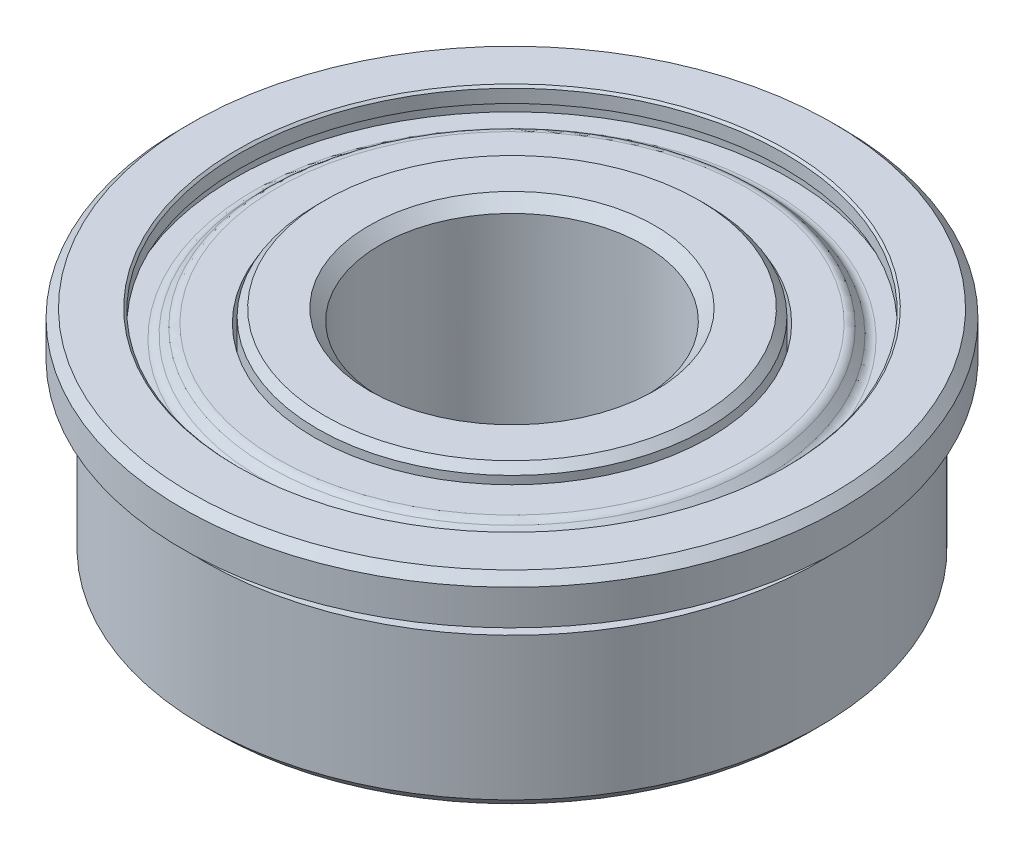
ISO-10303-21;
HEADER;
FILE_DESCRIPTION(('STEP AP214'),'2;1');
FILE_NAME('part.step','',(''),(''),'','','');
FILE_SCHEMA(('AUTOMOTIVE_DESIGN { 1 0 10303 214 1 1 1 1 }'));
ENDSEC;
DATA;
#1=APPLICATION_CONTEXT('core data for automotive mechanical design processes');
#2=APPLICATION_PROTOCOL_DEFINITION('international standard','automotive_design',2000,#1);
#3=PRODUCT_CONTEXT('',#1,'mechanical');
#4=PRODUCT('Part','Part','',(#3));
#5=PRODUCT_RELATED_PRODUCT_CATEGORY('part','',(#4));
#6=PRODUCT_DEFINITION_FORMATION('','',#4);
#7=PRODUCT_DEFINITION_CONTEXT('part definition',#1,'design');
#8=PRODUCT_DEFINITION('design','',#6,#7);
#9=PRODUCT_DEFINITION_SHAPE('','',#8);
#10=(LENGTH_UNIT() NAMED_UNIT(*) SI_UNIT(.MILLI.,.METRE.));
#11=(NAMED_UNIT(*) PLANE_ANGLE_UNIT() SI_UNIT($,.RADIAN.));
#12=(NAMED_UNIT(*) SI_UNIT($,.STERADIAN.) SOLID_ANGLE_UNIT());
#13=UNCERTAINTY_MEASURE_WITH_UNIT(LENGTH_MEASURE(1.E-05),#10,'distance_accuracy_value','');
#14=(GEOMETRIC_REPRESENTATION_CONTEXT(3) GLOBAL_UNCERTAINTY_ASSIGNED_CONTEXT((#13)) GLOBAL_UNIT_ASSIGNED_CONTEXT((#10,
#11,#12)) REPRESENTATION_CONTEXT('',''));
#15=CARTESIAN_POINT('',(0.,0.,0.));
#16=DIRECTION('',(0.,0.,1.));
#17=DIRECTION('',(1.,0.,0.));
#18=AXIS2_PLACEMENT_3D('',#15,#16,#17);
#19=CARTESIAN_POINT('',(0.,5.,0.));
#20=DIRECTION('',(0.,1.,0.));
#21=DIRECTION('',(0.,0.,1.));
#22=AXIS2_PLACEMENT_3D('',#19,#20,#21);
#23=PLANE('',#22);
#24=CARTESIAN_POINT('',(0.,4.99999999993861,0.));
#25=DIRECTION('',(0.,1.,0.));
#26=DIRECTION('',(0.,0.,1.));
#27=AXIS2_PLACEMENT_3D('',#24,#25,#26);
#28=CIRCLE('',#27,3.25400000002674);
#29=CARTESIAN_POINT('',(0.,4.99999999993861,3.25400000002674));
#30=VERTEX_POINT('',#29);
#31=EDGE_CURVE('E348',#30,#30,#28,.F.);
#32=ORIENTED_EDGE('',*,*,#31,.T.);
#33=EDGE_LOOP('',(#32));
#34=FACE_BOUND('',#33,.T.);
#35=CARTESIAN_POINT('',(0.,5.0000000000523,0.));
#36=DIRECTION('',(0.,-1.,0.));
#37=DIRECTION('',(0.,0.,-1.));
#38=AXIS2_PLACEMENT_3D('',#35,#36,#37);
#39=CIRCLE('',#38,4.25499999994372);
#40=CARTESIAN_POINT('',(0.,5.0000000000523,-4.25499999994372));
#41=VERTEX_POINT('',#40);
#42=EDGE_CURVE('E352',#41,#41,#39,.T.);
#43=ORIENTED_EDGE('',*,*,#42,.F.);
#44=EDGE_LOOP('',(#43));
#45=FACE_BOUND('',#44,.T.);
#46=ADVANCED_FACE('F16',(#34,#45),#23,.T.);
#47=CARTESIAN_POINT('',(0.,4.83000000014044,0.));
#48=DIRECTION('',(0.,-1.,0.));
#49=DIRECTION('',(0.,0.,-1.));
#50=AXIS2_PLACEMENT_3D('',#47,#48,#49);
#51=CONICAL_SURFACE('',#50,4.42499999985557,0.785398163397448);
#52=CARTESIAN_POINT('',(0.,4.83,0.));
#53=DIRECTION('',(0.,1.,0.));
#54=DIRECTION('',(0.,0.,1.));
#55=AXIS2_PLACEMENT_3D('',#52,#53,#54);
#56=CIRCLE('',#55,4.425);
#57=CARTESIAN_POINT('',(0.,4.83,4.425));
#58=VERTEX_POINT('',#57);
#59=EDGE_CURVE('E351',#58,#58,#56,.F.);
#60=ORIENTED_EDGE('',*,*,#59,.F.);
#61=EDGE_LOOP('',(#60));
#62=FACE_BOUND('',#61,.T.);
#63=ORIENTED_EDGE('',*,*,#42,.T.);
#64=EDGE_LOOP('',(#63));
#65=FACE_BOUND('',#64,.T.);
#66=ADVANCED_FACE('F137',(#62,#65),#51,.T.);
#67=CARTESIAN_POINT('',(0.,4.99999999993861,0.));
#68=DIRECTION('',(0.,1.,0.));
#69=DIRECTION('',(0.,0.,1.));
#70=AXIS2_PLACEMENT_3D('',#67,#68,#69);
#71=CONICAL_SURFACE('',#70,3.25400000002674,0.785398163397448);
#72=ORIENTED_EDGE('',*,*,#31,.F.);
#73=EDGE_LOOP('',(#72));
#74=FACE_BOUND('',#73,.T.);
#75=CARTESIAN_POINT('',(0.,4.746,0.));
#76=DIRECTION('',(0.,1.,0.));
#77=DIRECTION('',(0.,0.,1.));
#78=AXIS2_PLACEMENT_3D('',#75,#76,#77);
#79=CIRCLE('',#78,3.);
#80=CARTESIAN_POINT('',(0.,4.746,3.));
#81=VERTEX_POINT('',#80);
#82=EDGE_CURVE('E347',#81,#81,#79,.F.);
#83=ORIENTED_EDGE('',*,*,#82,.T.);
#84=EDGE_LOOP('',(#83));
#85=FACE_BOUND('',#84,.T.);
#86=ADVANCED_FACE('F134',(#74,#85),#71,.F.);
#87=CARTESIAN_POINT('',(0.,4.7,0.));
#88=DIRECTION('',(0.,1.,0.));
#89=DIRECTION('',(0.,0.,1.));
#90=AXIS2_PLACEMENT_3D('',#87,#88,#89);
#91=CYLINDRICAL_SURFACE('',#90,4.425);
#92=ORIENTED_EDGE('',*,*,#59,.T.);
#93=EDGE_LOOP('',(#92));
#94=FACE_BOUND('',#93,.T.);
#95=CARTESIAN_POINT('',(0.,3.43,0.));
#96=DIRECTION('',(0.,1.,0.));
#97=DIRECTION('',(0.,0.,1.));
#98=AXIS2_PLACEMENT_3D('',#95,#96,#97);
#99=CIRCLE('',#98,4.425);
#100=CARTESIAN_POINT('',(0.,3.43,4.425));
#101=VERTEX_POINT('',#100);
#102=EDGE_CURVE('E344',#101,#101,#99,.F.);
#103=ORIENTED_EDGE('',*,*,#102,.F.);
#104=EDGE_LOOP('',(#103));
#105=FACE_BOUND('',#104,.T.);
#106=ADVANCED_FACE('F130',(#94,#105),#91,.T.);
#107=CARTESIAN_POINT('',(0.,0.,0.));
#108=DIRECTION('',(0.,1.,0.));
#109=DIRECTION('',(0.,0.,1.));
#110=AXIS2_PLACEMENT_3D('',#107,#108,#109);
#111=CYLINDRICAL_SURFACE('',#110,3.);
#112=ORIENTED_EDGE('',*,*,#82,.F.);
#113=EDGE_LOOP('',(#112));
#114=FACE_BOUND('',#113,.T.);
#115=CARTESIAN_POINT('',(0.,0.253999999983989,0.));
#116=DIRECTION('',(0.,-1.,0.));
#117=DIRECTION('',(0.,0.,-1.));
#118=AXIS2_PLACEMENT_3D('',#115,#116,#117);
#119=CIRCLE('',#118,3.00000000004275);
#120=CARTESIAN_POINT('',(0.,0.253999999983989,-3.00000000004275));
#121=VERTEX_POINT('',#120);
#122=EDGE_CURVE('E77',#121,#121,#119,.T.);
#123=ORIENTED_EDGE('',*,*,#122,.T.);
#124=EDGE_LOOP('',(#123));
#125=FACE_BOUND('',#124,.T.);
#126=ADVANCED_FACE('F126',(#114,#125),#111,.F.);
#127=CARTESIAN_POINT('',(0.,3.43,0.));
#128=DIRECTION('',(0.,1.,0.));
#129=DIRECTION('',(0.,0.,1.));
#130=AXIS2_PLACEMENT_3D('',#127,#128,#129);
#131=PLANE('',#130);
#132=ORIENTED_EDGE('',*,*,#102,.T.);
#133=EDGE_LOOP('',(#132));
#134=FACE_BOUND('',#133,.T.);
#135=CARTESIAN_POINT('',(0.,3.43,0.));
#136=DIRECTION('',(0.,1.,0.));
#137=DIRECTION('',(0.,0.,1.));
#138=AXIS2_PLACEMENT_3D('',#135,#136,#137);
#139=CIRCLE('',#138,4.5012);
#140=CARTESIAN_POINT('',(0.,3.43,4.5012));
#141=VERTEX_POINT('',#140);
#142=EDGE_CURVE('E341',#141,#141,#139,.T.);
#143=ORIENTED_EDGE('',*,*,#142,.T.);
#144=EDGE_LOOP('',(#143));
#145=FACE_BOUND('',#144,.T.);
#146=ADVANCED_FACE('F122',(#134,#145),#131,.T.);
#147=CARTESIAN_POINT('',(0.,0.,0.));
#148=DIRECTION('',(0.,-1.,0.));
#149=DIRECTION('',(0.,0.,-1.));
#150=AXIS2_PLACEMENT_3D('',#147,#148,#149);
#151=CONICAL_SURFACE('',#150,3.25400000002674,0.785398163397448);
#152=CARTESIAN_POINT('',(0.,0.,0.));
#153=DIRECTION('',(0.,-1.,0.));
#154=DIRECTION('',(0.,0.,-1.));
#155=AXIS2_PLACEMENT_3D('',#152,#153,#154);
#156=CIRCLE('',#155,3.25400000002674);
#157=CARTESIAN_POINT('',(0.,0.,-3.25400000002674));
#158=VERTEX_POINT('',#157);
#159=EDGE_CURVE('E338',#158,#158,#156,.T.);
#160=ORIENTED_EDGE('',*,*,#159,.T.);
#161=EDGE_LOOP('',(#160));
#162=FACE_BOUND('',#161,.T.);
#163=ORIENTED_EDGE('',*,*,#122,.F.);
#164=EDGE_LOOP('',(#163));
#165=FACE_BOUND('',#164,.T.);
#166=ADVANCED_FACE('F118',(#162,#165),#151,.F.);
#167=CARTESIAN_POINT('',(0.,3.43,0.));
#168=DIRECTION('',(0.,1.,0.));
#169=DIRECTION('',(0.,0.,1.));
#170=AXIS2_PLACEMENT_3D('',#167,#168,#169);
#171=CYLINDRICAL_SURFACE('',#170,4.5012);
#172=CARTESIAN_POINT('',(0.,4.7,0.));
#173=DIRECTION('',(0.,1.,0.));
#174=DIRECTION('',(0.,0.,1.));
#175=AXIS2_PLACEMENT_3D('',#172,#173,#174);
#176=CIRCLE('',#175,4.5012);
#177=CARTESIAN_POINT('',(0.,4.7,4.5012));
#178=VERTEX_POINT('',#177);
#179=EDGE_CURVE('E335',#178,#178,#176,.F.);
#180=ORIENTED_EDGE('',*,*,#179,.F.);
#181=EDGE_LOOP('',(#180));
#182=FACE_BOUND('',#181,.T.);
#183=ORIENTED_EDGE('',*,*,#142,.F.);
#184=EDGE_LOOP('',(#183));
#185=FACE_BOUND('',#184,.T.);
#186=ADVANCED_FACE('F114',(#182,#185),#171,.F.);
#187=CARTESIAN_POINT('',(0.,0.,0.));
#188=DIRECTION('',(0.,1.,0.));
#189=DIRECTION('',(0.,0.,1.));
#190=AXIS2_PLACEMENT_3D('',#187,#188,#189);
#191=PLANE('',#190);
#192=ORIENTED_EDGE('',*,*,#159,.F.);
#193=EDGE_LOOP('',(#192));
#194=FACE_BOUND('',#193,.T.);
#195=CARTESIAN_POINT('',(0.,-5.6843418860808E-11,0.));
#196=DIRECTION('',(0.,1.,0.));
#197=DIRECTION('',(0.,0.,1.));
#198=AXIS2_PLACEMENT_3D('',#195,#196,#197);
#199=CIRCLE('',#198,4.25499999994372);
#200=CARTESIAN_POINT('',(0.,-5.6843418860808E-11,4.25499999994372));
#201=VERTEX_POINT('',#200);
#202=EDGE_CURVE('E63',#201,#201,#199,.T.);
#203=ORIENTED_EDGE('',*,*,#202,.F.);
#204=EDGE_LOOP('',(#203));
#205=FACE_BOUND('',#204,.T.);
#206=ADVANCED_FACE('F109',(#194,#205),#191,.F.);
#207=CARTESIAN_POINT('',(0.,4.7,0.));
#208=DIRECTION('',(0.,1.,0.));
#209=DIRECTION('',(0.,0.,1.));
#210=AXIS2_PLACEMENT_3D('',#207,#208,#209);
#211=PLANE('',#210);
#212=ORIENTED_EDGE('',*,*,#179,.T.);
#213=EDGE_LOOP('',(#212));
#214=FACE_BOUND('',#213,.T.);
#215=CARTESIAN_POINT('',(0.,4.7,0.));
#216=DIRECTION('',(0.,-1.,0.));
#217=DIRECTION('',(0.,0.,1.));
#218=AXIS2_PLACEMENT_3D('',#215,#216,#217);
#219=CIRCLE('',#218,5.344789755157);
#220=CARTESIAN_POINT('',(0.,4.7,5.344789755157));
#221=VERTEX_POINT('',#220);
#222=CARTESIAN_POINT('',(0.,4.7,-5.344789755157));
#223=VERTEX_POINT('',#222);
#224=EDGE_CURVE('E61',#221,#223,#219,.T.);
#225=ORIENTED_EDGE('',*,*,#224,.F.);
#226=CARTESIAN_POINT('',(0.,4.7,0.));
#227=DIRECTION('',(0.,-1.,0.));
#228=DIRECTION('',(0.,0.,-1.));
#229=AXIS2_PLACEMENT_3D('',#226,#227,#228);
#230=CIRCLE('',#229,5.344789755157);
#231=EDGE_CURVE('E56',#223,#221,#230,.T.);
#232=ORIENTED_EDGE('',*,*,#231,.F.);
#233=EDGE_LOOP('',(#225,#232));
#234=FACE_BOUND('',#233,.T.);
#235=ADVANCED_FACE('F60',(#214,#234),#211,.T.);
#236=CARTESIAN_POINT('',(0.,0.169999999968695,0.));
#237=DIRECTION('',(0.,1.,0.));
#238=DIRECTION('',(0.,0.,1.));
#239=AXIS2_PLACEMENT_3D('',#236,#237,#238);
#240=CONICAL_SURFACE('',#239,4.42499999996926,0.785398163397448);
#241=CARTESIAN_POINT('',(0.,0.17,0.));
#242=DIRECTION('',(0.,-1.,0.));
#243=DIRECTION('',(0.,0.,-1.));
#244=AXIS2_PLACEMENT_3D('',#241,#242,#243);
#245=CIRCLE('',#244,4.425);
#246=CARTESIAN_POINT('',(0.,0.17,-4.425));
#247=VERTEX_POINT('',#246);
#248=EDGE_CURVE('E69',#247,#247,#245,.F.);
#249=ORIENTED_EDGE('',*,*,#248,.F.);
#250=EDGE_LOOP('',(#249));
#251=FACE_BOUND('',#250,.T.);
#252=ORIENTED_EDGE('',*,*,#202,.T.);
#253=EDGE_LOOP('',(#252));
#254=FACE_BOUND('',#253,.T.);
#255=ADVANCED_FACE('F90',(#251,#254),#240,.T.);
#256=CARTESIAN_POINT('',(0.,4.446,0.));
#257=DIRECTION('',(0.,1.,0.));
#258=DIRECTION('',(0.,0.,1.));
#259=AXIS2_PLACEMENT_3D('',#256,#257,#258);
#260=TOROIDAL_SURFACE('',#259,5.344789755157,0.254);
#261=ORIENTED_EDGE('',*,*,#231,.T.);
#262=ORIENTED_EDGE('',*,*,#224,.T.);
#263=EDGE_LOOP('',(#261,#262));
#264=FACE_BOUND('',#263,.T.);
#265=CARTESIAN_POINT('',(0.,4.62560512238497,0.));
#266=DIRECTION('',(0.,-1.,0.));
#267=DIRECTION('',(0.,0.,-1.));
#268=AXIS2_PLACEMENT_3D('',#265,#266,#267);
#269=CIRCLE('',#268,5.52439487756828);
#270=CARTESIAN_POINT('',(0.,4.62560512238497,-5.52439487756828));
#271=VERTEX_POINT('',#270);
#272=EDGE_CURVE('E96',#271,#271,#269,.T.);
#273=ORIENTED_EDGE('',*,*,#272,.F.);
#274=EDGE_LOOP('',(#273));
#275=FACE_BOUND('',#274,.T.);
#276=ADVANCED_FACE('F67',(#264,#275),#260,.T.);
#277=CARTESIAN_POINT('',(0.,0.254,0.));
#278=DIRECTION('',(0.,-1.,0.));
#279=DIRECTION('',(0.,0.,-1.));
#280=AXIS2_PLACEMENT_3D('',#277,#278,#279);
#281=CYLINDRICAL_SURFACE('',#280,4.425);
#282=ORIENTED_EDGE('',*,*,#248,.T.);
#283=EDGE_LOOP('',(#282));
#284=FACE_BOUND('',#283,.T.);
#285=CARTESIAN_POINT('',(0.,1.524,0.));
#286=DIRECTION('',(0.,-1.,0.));
#287=DIRECTION('',(0.,0.,-1.));
#288=AXIS2_PLACEMENT_3D('',#285,#286,#287);
#289=CIRCLE('',#288,4.425);
#290=CARTESIAN_POINT('',(0.,1.524,-4.425));
#291=VERTEX_POINT('',#290);
#292=EDGE_CURVE('E321',#291,#291,#289,.F.);
#293=ORIENTED_EDGE('',*,*,#292,.F.);
#294=EDGE_LOOP('',(#293));
#295=FACE_BOUND('',#294,.T.);
#296=ADVANCED_FACE('F89',(#284,#295),#281,.T.);
#297=CARTESIAN_POINT('',(0.,4.46959487754839,0.));
#298=DIRECTION('',(0.,-1.,0.));
#299=DIRECTION('',(0.,0.,-1.));
#300=AXIS2_PLACEMENT_3D('',#297,#298,#299);
#301=CONICAL_SURFACE('',#300,5.68040512240486,0.785398163397448);
#302=CARTESIAN_POINT('',(0.,4.46959487757912,0.));
#303=DIRECTION('',(0.,-1.,0.));
#304=DIRECTION('',(0.,0.,-1.));
#305=AXIS2_PLACEMENT_3D('',#302,#303,#304);
#306=CIRCLE('',#305,5.68040512242112);
#307=CARTESIAN_POINT('',(0.,4.46959487757912,-5.68040512242112));
#308=VERTEX_POINT('',#307);
#309=EDGE_CURVE('E313',#308,#308,#306,.F.);
#310=ORIENTED_EDGE('',*,*,#309,.T.);
#311=EDGE_LOOP('',(#310));
#312=FACE_BOUND('',#311,.T.);
#313=ORIENTED_EDGE('',*,*,#272,.T.);
#314=EDGE_LOOP('',(#313));
#315=FACE_BOUND('',#314,.T.);
#316=ADVANCED_FACE('F408',(#312,#315),#301,.T.);
#317=CARTESIAN_POINT('',(0.,1.524,0.));
#318=DIRECTION('',(0.,-1.,0.));
#319=DIRECTION('',(0.,0.,-1.));
#320=AXIS2_PLACEMENT_3D('',#317,#318,#319);
#321=PLANE('',#320);
#322=ORIENTED_EDGE('',*,*,#292,.T.);
#323=EDGE_LOOP('',(#322));
#324=FACE_BOUND('',#323,.T.);
#325=CARTESIAN_POINT('',(0.,1.524,0.));
#326=DIRECTION('',(0.,-1.,0.));
#327=DIRECTION('',(0.,0.,-1.));
#328=AXIS2_PLACEMENT_3D('',#325,#326,#327);
#329=CIRCLE('',#328,4.5012);
#330=CARTESIAN_POINT('',(0.,1.524,-4.5012));
#331=VERTEX_POINT('',#330);
#332=EDGE_CURVE('E320',#331,#331,#329,.T.);
#333=ORIENTED_EDGE('',*,*,#332,.T.);
#334=EDGE_LOOP('',(#333));
#335=FACE_BOUND('',#334,.T.);
#336=ADVANCED_FACE('F299',(#324,#335),#321,.T.);
#337=CARTESIAN_POINT('',(0.,4.6492,0.));
#338=DIRECTION('',(0.,-1.,0.));
#339=DIRECTION('',(0.,0.,-1.));
#340=AXIS2_PLACEMENT_3D('',#337,#338,#339);
#341=TOROIDAL_SURFACE('',#340,5.860010244843,0.254);
#342=ORIENTED_EDGE('',*,*,#309,.F.);
#343=EDGE_LOOP('',(#342));
#344=FACE_BOUND('',#343,.T.);
#345=CARTESIAN_POINT('',(0.,4.3952,0.));
#346=DIRECTION('',(0.,1.,0.));
#347=DIRECTION('',(0.,0.,1.));
#348=AXIS2_PLACEMENT_3D('',#345,#346,#347);
#349=CIRCLE('',#348,5.860010244843);
#350=CARTESIAN_POINT('',(0.,4.3952,5.860010244843));
#351=VERTEX_POINT('',#350);
#352=CARTESIAN_POINT('',(0.,4.3952,-5.860010244843));
#353=VERTEX_POINT('',#352);
#354=EDGE_CURVE('E282',#351,#353,#349,.T.);
#355=ORIENTED_EDGE('',*,*,#354,.T.);
#356=CARTESIAN_POINT('',(0.,4.3952,0.));
#357=DIRECTION('',(0.,1.,0.));
#358=DIRECTION('',(0.,0.,-1.));
#359=AXIS2_PLACEMENT_3D('',#356,#357,#358);
#360=CIRCLE('',#359,5.860010244843);
#361=EDGE_CURVE('E310',#353,#351,#360,.T.);
#362=ORIENTED_EDGE('',*,*,#361,.T.);
#363=EDGE_LOOP('',(#355,#362));
#364=FACE_BOUND('',#363,.T.);
#365=ADVANCED_FACE('F287',(#344,#364),#341,.F.);
#366=CARTESIAN_POINT('',(0.,1.524,0.));
#367=DIRECTION('',(0.,-1.,0.));
#368=DIRECTION('',(0.,0.,-1.));
#369=AXIS2_PLACEMENT_3D('',#366,#367,#368);
#370=CYLINDRICAL_SURFACE('',#369,4.5012);
#371=CARTESIAN_POINT('',(0.,0.254,0.));
#372=DIRECTION('',(0.,-1.,0.));
#373=DIRECTION('',(0.,0.,-1.));
#374=AXIS2_PLACEMENT_3D('',#371,#372,#373);
#375=CIRCLE('',#374,4.5012);
#376=CARTESIAN_POINT('',(0.,0.254,-4.5012));
#377=VERTEX_POINT('',#376);
#378=EDGE_CURVE('E395',#377,#377,#375,.F.);
#379=ORIENTED_EDGE('',*,*,#378,.F.);
#380=EDGE_LOOP('',(#379));
#381=FACE_BOUND('',#380,.T.);
#382=ORIENTED_EDGE('',*,*,#332,.F.);
#383=EDGE_LOOP('',(#382));
#384=FACE_BOUND('',#383,.T.);
#385=ADVANCED_FACE('F298',(#381,#384),#370,.F.);
#386=CARTESIAN_POINT('',(0.,4.3952,6.2));
#387=DIRECTION('',(0.,-1.,0.));
#388=DIRECTION('',(0.,0.,-1.));
#389=AXIS2_PLACEMENT_3D('',#386,#387,#388);
#390=PLANE('',#389);
#391=ORIENTED_EDGE('',*,*,#354,.F.);
#392=ORIENTED_EDGE('',*,*,#361,.F.);
#393=EDGE_LOOP('',(#391,#392));
#394=FACE_BOUND('',#393,.T.);
#395=CARTESIAN_POINT('',(0.,4.3952,0.));
#396=DIRECTION('',(0.,1.,0.));
#397=DIRECTION('',(0.,0.,1.));
#398=AXIS2_PLACEMENT_3D('',#395,#396,#397);
#399=CIRCLE('',#398,6.327);
#400=CARTESIAN_POINT('',(0.,4.3952,6.327));
#401=VERTEX_POINT('',#400);
#402=EDGE_CURVE('E393',#401,#401,#399,.T.);
#403=ORIENTED_EDGE('',*,*,#402,.T.);
#404=EDGE_LOOP('',(#403));
#405=FACE_BOUND('',#404,.T.);
#406=ADVANCED_FACE('F404',(#394,#405),#390,.F.);
#407=CARTESIAN_POINT('',(0.,0.254,0.));
#408=DIRECTION('',(0.,-1.,0.));
#409=DIRECTION('',(0.,0.,-1.));
#410=AXIS2_PLACEMENT_3D('',#407,#408,#409);
#411=PLANE('',#410);
#412=ORIENTED_EDGE('',*,*,#378,.T.);
#413=EDGE_LOOP('',(#412));
#414=FACE_BOUND('',#413,.T.);
#415=CARTESIAN_POINT('',(0.,0.254,0.));
#416=DIRECTION('',(0.,1.,0.));
#417=DIRECTION('',(0.,0.,-1.));
#418=AXIS2_PLACEMENT_3D('',#415,#416,#417);
#419=CIRCLE('',#418,5.344789755157);
#420=CARTESIAN_POINT('',(0.,0.254,-5.344789755157));
#421=VERTEX_POINT('',#420);
#422=CARTESIAN_POINT('',(0.,0.254,5.344789755157));
#423=VERTEX_POINT('',#422);
#424=EDGE_CURVE('E386',#421,#423,#419,.T.);
#425=ORIENTED_EDGE('',*,*,#424,.F.);
#426=CARTESIAN_POINT('',(0.,0.254,0.));
#427=DIRECTION('',(0.,1.,0.));
#428=DIRECTION('',(0.,0.,1.));
#429=AXIS2_PLACEMENT_3D('',#426,#427,#428);
#430=CIRCLE('',#429,5.344789755157);
#431=EDGE_CURVE('E391',#423,#421,#430,.T.);
#432=ORIENTED_EDGE('',*,*,#431,.F.);
#433=EDGE_LOOP('',(#425,#432));
#434=FACE_BOUND('',#433,.T.);
#435=ADVANCED_FACE('F399',(#414,#434),#411,.T.);
#436=CARTESIAN_POINT('',(0.,0.,0.));
#437=DIRECTION('',(0.,1.,0.));
#438=DIRECTION('',(0.,0.,1.));
#439=AXIS2_PLACEMENT_3D('',#436,#437,#438);
#440=CYLINDRICAL_SURFACE('',#439,6.327);
#441=CARTESIAN_POINT('',(0.,4.6492,0.));
#442=DIRECTION('',(0.,1.,0.));
#443=DIRECTION('',(0.,0.,1.));
#444=AXIS2_PLACEMENT_3D('',#441,#442,#443);
#445=CIRCLE('',#444,6.327);
#446=CARTESIAN_POINT('',(0.,4.6492,6.327));
#447=VERTEX_POINT('',#446);
#448=EDGE_CURVE('E382',#447,#447,#445,.T.);
#449=ORIENTED_EDGE('',*,*,#448,.T.);
#450=EDGE_LOOP('',(#449));
#451=FACE_BOUND('',#450,.T.);
#452=ORIENTED_EDGE('',*,*,#402,.F.);
#453=EDGE_LOOP('',(#452));
#454=FACE_BOUND('',#453,.T.);
#455=ADVANCED_FACE('F258',(#451,#454),#440,.F.);
#456=CARTESIAN_POINT('',(0.,0.508,0.));
#457=DIRECTION('',(0.,-1.,0.));
#458=DIRECTION('',(0.,0.,-1.));
#459=AXIS2_PLACEMENT_3D('',#456,#457,#458);
#460=TOROIDAL_SURFACE('',#459,5.344789755157,0.254);
#461=ORIENTED_EDGE('',*,*,#431,.T.);
#462=ORIENTED_EDGE('',*,*,#424,.T.);
#463=EDGE_LOOP('',(#461,#462));
#464=FACE_BOUND('',#463,.T.);
#465=CARTESIAN_POINT('',(0.,0.328394877556093,0.));
#466=DIRECTION('',(0.,1.,0.));
#467=DIRECTION('',(0.,0.,-1.));
#468=AXIS2_PLACEMENT_3D('',#465,#466,#467);
#469=CIRCLE('',#468,5.52439487756828);
#470=CARTESIAN_POINT('',(0.,0.328394877556093,-5.52439487756828));
#471=VERTEX_POINT('',#470);
#472=EDGE_CURVE('E249',#471,#471,#469,.T.);
#473=ORIENTED_EDGE('',*,*,#472,.F.);
#474=EDGE_LOOP('',(#473));
#475=FACE_BOUND('',#474,.T.);
#476=ADVANCED_FACE('F252',(#464,#475),#460,.T.);
#477=CARTESIAN_POINT('',(-6.2,4.6492,0.));
#478=DIRECTION('',(0.,1.,0.));
#479=DIRECTION('',(0.,0.,1.));
#480=AXIS2_PLACEMENT_3D('',#477,#478,#479);
#481=PLANE('',#480);
#482=CARTESIAN_POINT('',(0.,4.6492,0.));
#483=DIRECTION('',(0.,1.,0.));
#484=DIRECTION('',(0.,0.,1.));
#485=AXIS2_PLACEMENT_3D('',#482,#483,#484);
#486=CIRCLE('',#485,6.2);
#487=CARTESIAN_POINT('',(0.,4.6492,6.2));
#488=VERTEX_POINT('',#487);
#489=EDGE_CURVE('E241',#488,#488,#486,.T.);
#490=ORIENTED_EDGE('',*,*,#489,.T.);
#491=EDGE_LOOP('',(#490));
#492=FACE_BOUND('',#491,.T.);
#493=ORIENTED_EDGE('',*,*,#448,.F.);
#494=EDGE_LOOP('',(#493));
#495=FACE_BOUND('',#494,.T.);
#496=ADVANCED_FACE('F257',(#492,#495),#481,.F.);
#497=CARTESIAN_POINT('',(0.,0.484405122278986,0.));
#498=DIRECTION('',(0.,1.,0.));
#499=DIRECTION('',(-1.,0.,0.));
#500=AXIS2_PLACEMENT_3D('',#497,#498,#499);
#501=CONICAL_SURFACE('',#500,5.68040512229118,0.785398163397448);
#502=CARTESIAN_POINT('',(0.,0.484405122421083,0.));
#503=DIRECTION('',(0.,1.,0.));
#504=DIRECTION('',(0.,0.,1.));
#505=AXIS2_PLACEMENT_3D('',#502,#503,#504);
#506=CIRCLE('',#505,5.68040512242132);
#507=CARTESIAN_POINT('',(0.,0.484405122421083,5.68040512242132));
#508=VERTEX_POINT('',#507);
#509=EDGE_CURVE('E236',#508,#508,#506,.F.);
#510=ORIENTED_EDGE('',*,*,#509,.T.);
#511=EDGE_LOOP('',(#510));
#512=FACE_BOUND('',#511,.T.);
#513=ORIENTED_EDGE('',*,*,#472,.T.);
#514=EDGE_LOOP('',(#513));
#515=FACE_BOUND('',#514,.T.);
#516=ADVANCED_FACE('F370',(#512,#515),#501,.T.);
#517=CARTESIAN_POINT('',(0.,4.7,0.));
#518=DIRECTION('',(0.,1.,0.));
#519=DIRECTION('',(0.,0.,1.));
#520=AXIS2_PLACEMENT_3D('',#517,#518,#519);
#521=CYLINDRICAL_SURFACE('',#520,6.2);
#522=CARTESIAN_POINT('',(0.,4.94999999995116,0.));
#523=DIRECTION('',(0.,1.,0.));
#524=DIRECTION('',(0.,0.,1.));
#525=AXIS2_PLACEMENT_3D('',#522,#523,#524);
#526=CIRCLE('',#525,6.1999999999216);
#527=CARTESIAN_POINT('',(0.,4.94999999995116,6.1999999999216));
#528=VERTEX_POINT('',#527);
#529=EDGE_CURVE('E234',#528,#528,#526,.T.);
#530=ORIENTED_EDGE('',*,*,#529,.T.);
#531=EDGE_LOOP('',(#530));
#532=FACE_BOUND('',#531,.T.);
#533=ORIENTED_EDGE('',*,*,#489,.F.);
#534=EDGE_LOOP('',(#533));
#535=FACE_BOUND('',#534,.T.);
#536=ADVANCED_FACE('F365',(#532,#535),#521,.F.);
#537=CARTESIAN_POINT('',(0.,0.3048,0.));
#538=DIRECTION('',(0.,1.,0.));
#539=DIRECTION('',(0.,0.,1.));
#540=AXIS2_PLACEMENT_3D('',#537,#538,#539);
#541=TOROIDAL_SURFACE('',#540,5.860010244843,0.254);
#542=ORIENTED_EDGE('',*,*,#509,.F.);
#543=EDGE_LOOP('',(#542));
#544=FACE_BOUND('',#543,.T.);
#545=CARTESIAN_POINT('',(0.,0.5588,0.));
#546=DIRECTION('',(0.,-1.,0.));
#547=DIRECTION('',(0.,0.,-1.));
#548=AXIS2_PLACEMENT_3D('',#545,#546,#547);
#549=CIRCLE('',#548,5.860010244843);
#550=CARTESIAN_POINT('',(0.,0.5588,-5.860010244843));
#551=VERTEX_POINT('',#550);
#552=CARTESIAN_POINT('',(0.,0.5588,5.860010244843));
#553=VERTEX_POINT('',#552);
#554=EDGE_CURVE('E35',#551,#553,#549,.T.);
#555=ORIENTED_EDGE('',*,*,#554,.T.);
#556=CARTESIAN_POINT('',(0.,0.5588,0.));
#557=DIRECTION('',(0.,-1.,0.));
#558=DIRECTION('',(0.,0.,1.));
#559=AXIS2_PLACEMENT_3D('',#556,#557,#558);
#560=CIRCLE('',#559,5.860010244843);
#561=EDGE_CURVE('E227',#553,#551,#560,.T.);
#562=ORIENTED_EDGE('',*,*,#561,.T.);
#563=EDGE_LOOP('',(#555,#562));
#564=FACE_BOUND('',#563,.T.);
#565=ADVANCED_FACE('F356',(#544,#564),#541,.F.);
#566=CARTESIAN_POINT('',(0.,4.99999999993861,0.));
#567=DIRECTION('',(0.,1.,0.));
#568=DIRECTION('',(0.,0.,1.));
#569=AXIS2_PLACEMENT_3D('',#566,#567,#568);
#570=CONICAL_SURFACE('',#569,6.24999999990905,0.785398163397448);
#571=CARTESIAN_POINT('',(0.,4.99999999999545,0.));
#572=DIRECTION('',(0.,1.,0.));
#573=DIRECTION('',(0.,0.,1.));
#574=AXIS2_PLACEMENT_3D('',#571,#572,#573);
#575=CIRCLE('',#574,6.24999999996589);
#576=CARTESIAN_POINT('',(0.,4.99999999999545,6.24999999996589));
#577=VERTEX_POINT('',#576);
#578=EDGE_CURVE('E230',#577,#577,#575,.F.);
#579=ORIENTED_EDGE('',*,*,#578,.F.);
#580=EDGE_LOOP('',(#579));
#581=FACE_BOUND('',#580,.T.);
#582=ORIENTED_EDGE('',*,*,#529,.F.);
#583=EDGE_LOOP('',(#582));
#584=FACE_BOUND('',#583,.T.);
#585=ADVANCED_FACE('F208',(#581,#584),#570,.F.);
#586=CARTESIAN_POINT('',(0.,0.5588,6.2));
#587=DIRECTION('',(0.,1.,0.));
#588=DIRECTION('',(0.,0.,1.));
#589=AXIS2_PLACEMENT_3D('',#586,#587,#588);
#590=PLANE('',#589);
#591=ORIENTED_EDGE('',*,*,#554,.F.);
#592=ORIENTED_EDGE('',*,*,#561,.F.);
#593=EDGE_LOOP('',(#591,#592));
#594=FACE_BOUND('',#593,.T.);
#595=CARTESIAN_POINT('',(0.,0.5588,0.));
#596=DIRECTION('',(0.,-1.,0.));
#597=DIRECTION('',(0.,0.,-1.));
#598=AXIS2_PLACEMENT_3D('',#595,#596,#597);
#599=CIRCLE('',#598,6.327);
#600=CARTESIAN_POINT('',(0.,0.5588,-6.327));
#601=VERTEX_POINT('',#600);
#602=EDGE_CURVE('E232',#601,#601,#599,.T.);
#603=ORIENTED_EDGE('',*,*,#602,.T.);
#604=EDGE_LOOP('',(#603));
#605=FACE_BOUND('',#604,.T.);
#606=ADVANCED_FACE('F203',(#594,#605),#590,.F.);
#607=CARTESIAN_POINT('',(0.,5.,0.));
#608=DIRECTION('',(0.,1.,0.));
#609=DIRECTION('',(0.,0.,1.));
#610=AXIS2_PLACEMENT_3D('',#607,#608,#609);
#611=PLANE('',#610);
#612=ORIENTED_EDGE('',*,*,#578,.T.);
#613=EDGE_LOOP('',(#612));
#614=FACE_BOUND('',#613,.T.);
#615=CARTESIAN_POINT('',(0.,5.00000000000002,0.));
#616=DIRECTION('',(0.,-1.,0.));
#617=DIRECTION('',(1.,0.,0.));
#618=AXIS2_PLACEMENT_3D('',#615,#616,#617);
#619=CIRCLE('',#618,7.30000000000001);
#620=CARTESIAN_POINT('',(7.30000000000001,5.00000000000002,0.));
#621=VERTEX_POINT('',#620);
#622=EDGE_CURVE('E615',#621,#621,#619,.T.);
#623=ORIENTED_EDGE('',*,*,#622,.F.);
#624=EDGE_LOOP('',(#623));
#625=FACE_BOUND('',#624,.T.);
#626=ADVANCED_FACE('F199',(#614,#625),#611,.T.);
#627=CARTESIAN_POINT('',(0.,4.954,0.));
#628=DIRECTION('',(0.,-1.,0.));
#629=DIRECTION('',(0.,0.,-1.));
#630=AXIS2_PLACEMENT_3D('',#627,#628,#629);
#631=CYLINDRICAL_SURFACE('',#630,6.327);
#632=CARTESIAN_POINT('',(0.,0.3048,0.));
#633=DIRECTION('',(0.,-1.,0.));
#634=DIRECTION('',(0.,0.,-1.));
#635=AXIS2_PLACEMENT_3D('',#632,#633,#634);
#636=CIRCLE('',#635,6.327);
#637=CARTESIAN_POINT('',(0.,0.3048,-6.327));
#638=VERTEX_POINT('',#637);
#639=EDGE_CURVE('E617',#638,#638,#636,.T.);
#640=ORIENTED_EDGE('',*,*,#639,.T.);
#641=EDGE_LOOP('',(#640));
#642=FACE_BOUND('',#641,.T.);
#643=ORIENTED_EDGE('',*,*,#602,.F.);
#644=EDGE_LOOP('',(#643));
#645=FACE_BOUND('',#644,.T.);
#646=ADVANCED_FACE('F195',(#642,#645),#631,.F.);
#647=CARTESIAN_POINT('',(0.,4.79999999999999,0.));
#648=DIRECTION('',(0.,-1.,0.));
#649=DIRECTION('',(1.,0.,0.));
#650=AXIS2_PLACEMENT_3D('',#647,#648,#649);
#651=CONICAL_SURFACE('',#650,7.49999999999999,0.785398163397301);
#652=CARTESIAN_POINT('',(0.,4.8,0.));
#653=DIRECTION('',(0.,-1.,0.));
#654=DIRECTION('',(0.,0.,-1.));
#655=AXIS2_PLACEMENT_3D('',#652,#653,#654);
#656=CIRCLE('',#655,7.5);
#657=CARTESIAN_POINT('',(0.,4.8,-7.5));
#658=VERTEX_POINT('',#657);
#659=EDGE_CURVE('E620',#658,#658,#656,.T.);
#660=ORIENTED_EDGE('',*,*,#659,.F.);
#661=EDGE_LOOP('',(#660));
#662=FACE_BOUND('',#661,.T.);
#663=ORIENTED_EDGE('',*,*,#622,.T.);
#664=EDGE_LOOP('',(#663));
#665=FACE_BOUND('',#664,.T.);
#666=ADVANCED_FACE('F191',(#662,#665),#651,.T.);
#667=CARTESIAN_POINT('',(-6.2,0.3048,0.));
#668=DIRECTION('',(0.,-1.,0.));
#669=DIRECTION('',(0.,0.,-1.));
#670=AXIS2_PLACEMENT_3D('',#667,#668,#669);
#671=PLANE('',#670);
#672=CARTESIAN_POINT('',(0.,0.3048,0.));
#673=DIRECTION('',(0.,-1.,0.));
#674=DIRECTION('',(0.,0.,-1.));
#675=AXIS2_PLACEMENT_3D('',#672,#673,#674);
#676=CIRCLE('',#675,6.2);
#677=CARTESIAN_POINT('',(0.,0.3048,-6.2));
#678=VERTEX_POINT('',#677);
#679=EDGE_CURVE('E625',#678,#678,#676,.T.);
#680=ORIENTED_EDGE('',*,*,#679,.T.);
#681=EDGE_LOOP('',(#680));
#682=FACE_BOUND('',#681,.T.);
#683=ORIENTED_EDGE('',*,*,#639,.F.);
#684=EDGE_LOOP('',(#683));
#685=FACE_BOUND('',#684,.T.);
#686=ADVANCED_FACE('F187',(#682,#685),#671,.F.);
#687=CARTESIAN_POINT('',(0.,5.,0.));
#688=DIRECTION('',(0.,-1.,0.));
#689=DIRECTION('',(0.,0.,-1.));
#690=AXIS2_PLACEMENT_3D('',#687,#688,#689);
#691=CYLINDRICAL_SURFACE('',#690,7.5);
#692=CARTESIAN_POINT('',(0.,4.,0.));
#693=DIRECTION('',(0.,-1.,0.));
#694=DIRECTION('',(0.,0.,-1.));
#695=AXIS2_PLACEMENT_3D('',#692,#693,#694);
#696=CIRCLE('',#695,7.5);
#697=CARTESIAN_POINT('',(0.,4.,-7.5));
#698=VERTEX_POINT('',#697);
#699=EDGE_CURVE('E628',#698,#698,#696,.F.);
#700=ORIENTED_EDGE('',*,*,#699,.T.);
#701=EDGE_LOOP('',(#700));
#702=FACE_BOUND('',#701,.T.);
#703=ORIENTED_EDGE('',*,*,#659,.T.);
#704=EDGE_LOOP('',(#703));
#705=FACE_BOUND('',#704,.T.);
#706=ADVANCED_FACE('F183',(#702,#705),#691,.T.);
#707=CARTESIAN_POINT('',(0.,0.254,0.));
#708=DIRECTION('',(0.,-1.,0.));
#709=DIRECTION('',(0.,0.,-1.));
#710=AXIS2_PLACEMENT_3D('',#707,#708,#709);
#711=CYLINDRICAL_SURFACE('',#710,6.2);
#712=CARTESIAN_POINT('',(0.,0.0500000000442924,0.));
#713=DIRECTION('',(0.,-1.,0.));
#714=DIRECTION('',(0.,0.,-1.));
#715=AXIS2_PLACEMENT_3D('',#712,#713,#714);
#716=CIRCLE('',#715,6.1999999999216);
#717=CARTESIAN_POINT('',(0.,0.0500000000442924,-6.1999999999216));
#718=VERTEX_POINT('',#717);
#719=EDGE_CURVE('E631',#718,#718,#716,.T.);
#720=ORIENTED_EDGE('',*,*,#719,.T.);
#721=EDGE_LOOP('',(#720));
#722=FACE_BOUND('',#721,.T.);
#723=ORIENTED_EDGE('',*,*,#679,.F.);
#724=EDGE_LOOP('',(#723));
#725=FACE_BOUND('',#724,.T.);
#726=ADVANCED_FACE('F179',(#722,#725),#711,.F.);
#727=CARTESIAN_POINT('',(0.,4.,0.));
#728=DIRECTION('',(0.,1.,0.));
#729=DIRECTION('',(0.,0.,1.));
#730=AXIS2_PLACEMENT_3D('',#727,#728,#729);
#731=PLANE('',#730);
#732=CARTESIAN_POINT('',(0.,4.,0.));
#733=DIRECTION('',(0.,1.,0.));
#734=DIRECTION('',(0.,0.,1.));
#735=AXIS2_PLACEMENT_3D('',#732,#733,#734);
#736=CIRCLE('',#735,6.746);
#737=CARTESIAN_POINT('',(0.,4.,6.746));
#738=VERTEX_POINT('',#737);
#739=EDGE_CURVE('E632',#738,#738,#736,.F.);
#740=ORIENTED_EDGE('',*,*,#739,.F.);
#741=EDGE_LOOP('',(#740));
#742=FACE_BOUND('',#741,.T.);
#743=ORIENTED_EDGE('',*,*,#699,.F.);
#744=EDGE_LOOP('',(#743));
#745=FACE_BOUND('',#744,.T.);
#746=ADVANCED_FACE('F175',(#742,#745),#731,.F.);
#747=CARTESIAN_POINT('',(0.,5.6843418860808E-11,0.));
#748=DIRECTION('',(0.,-1.,0.));
#749=DIRECTION('',(0.,0.,-1.));
#750=AXIS2_PLACEMENT_3D('',#747,#748,#749);
#751=CONICAL_SURFACE('',#750,6.24999999990905,0.785398163397448);
#752=CARTESIAN_POINT('',(0.,0.,0.));
#753=DIRECTION('',(0.,-1.,0.));
#754=DIRECTION('',(0.,0.,-1.));
#755=AXIS2_PLACEMENT_3D('',#752,#753,#754);
#756=CIRCLE('',#755,6.24999999996589);
#757=CARTESIAN_POINT('',(0.,0.,-6.24999999996589));
#758=VERTEX_POINT('',#757);
#759=EDGE_CURVE('E635',#758,#758,#756,.T.);
#760=ORIENTED_EDGE('',*,*,#759,.T.);
#761=EDGE_LOOP('',(#760));
#762=FACE_BOUND('',#761,.T.);
#763=ORIENTED_EDGE('',*,*,#719,.F.);
#764=EDGE_LOOP('',(#763));
#765=FACE_BOUND('',#764,.T.);
#766=ADVANCED_FACE('F171',(#762,#765),#751,.F.);
#767=CARTESIAN_POINT('',(0.,0.,0.));
#768=DIRECTION('',(0.,1.,0.));
#769=DIRECTION('',(0.,0.,1.));
#770=AXIS2_PLACEMENT_3D('',#767,#768,#769);
#771=CYLINDRICAL_SURFACE('',#770,6.746);
#772=ORIENTED_EDGE('',*,*,#739,.T.);
#773=EDGE_LOOP('',(#772));
#774=FACE_BOUND('',#773,.T.);
#775=CARTESIAN_POINT('',(0.,3.5,0.));
#776=DIRECTION('',(0.,1.,0.));
#777=DIRECTION('',(0.,0.,1.));
#778=AXIS2_PLACEMENT_3D('',#775,#776,#777);
#779=CIRCLE('',#778,6.746);
#780=CARTESIAN_POINT('',(0.,3.5,6.746));
#781=VERTEX_POINT('',#780);
#782=EDGE_CURVE('E638',#781,#781,#779,.F.);
#783=ORIENTED_EDGE('',*,*,#782,.F.);
#784=EDGE_LOOP('',(#783));
#785=FACE_BOUND('',#784,.T.);
#786=ADVANCED_FACE('F167',(#774,#785),#771,.T.);
#787=CARTESIAN_POINT('',(0.,0.,0.));
#788=DIRECTION('',(0.,1.,0.));
#789=DIRECTION('',(0.,0.,1.));
#790=AXIS2_PLACEMENT_3D('',#787,#788,#789);
#791=PLANE('',#790);
#792=ORIENTED_EDGE('',*,*,#759,.F.);
#793=EDGE_LOOP('',(#792));
#794=FACE_BOUND('',#793,.T.);
#795=CARTESIAN_POINT('',(0.,5.6843418860808E-11,0.));
#796=DIRECTION('',(0.,1.,0.));
#797=DIRECTION('',(0.,0.,1.));
#798=AXIS2_PLACEMENT_3D('',#795,#796,#797);
#799=CIRCLE('',#798,6.74599999996417);
#800=CARTESIAN_POINT('',(0.,5.6843418860808E-11,6.74599999996417));
#801=VERTEX_POINT('',#800);
#802=EDGE_CURVE('E641',#801,#801,#799,.T.);
#803=ORIENTED_EDGE('',*,*,#802,.F.);
#804=EDGE_LOOP('',(#803));
#805=FACE_BOUND('',#804,.T.);
#806=ADVANCED_FACE('F163',(#794,#805),#791,.F.);
#807=CARTESIAN_POINT('',(7.,3.5,0.));
#808=DIRECTION('',(0.,1.,0.));
#809=DIRECTION('',(0.,0.,1.));
#810=AXIS2_PLACEMENT_3D('',#807,#808,#809);
#811=PLANE('',#810);
#812=ORIENTED_EDGE('',*,*,#782,.T.);
#813=EDGE_LOOP('',(#812));
#814=FACE_BOUND('',#813,.T.);
#815=CARTESIAN_POINT('',(0.,3.5,0.));
#816=DIRECTION('',(0.,-1.,0.));
#817=DIRECTION('',(0.,0.,-1.));
#818=AXIS2_PLACEMENT_3D('',#815,#816,#817);
#819=CIRCLE('',#818,7.);
#820=CARTESIAN_POINT('',(0.,3.5,-7.));
#821=VERTEX_POINT('',#820);
#822=EDGE_CURVE('E27',#821,#821,#819,.T.);
#823=ORIENTED_EDGE('',*,*,#822,.F.);
#824=EDGE_LOOP('',(#823));
#825=FACE_BOUND('',#824,.T.);
#826=ADVANCED_FACE('F156',(#814,#825),#811,.T.);
#827=CARTESIAN_POINT('',(0.,0.253999999983989,0.));
#828=DIRECTION('',(0.,1.,0.));
#829=DIRECTION('',(0.,0.,1.));
#830=AXIS2_PLACEMENT_3D('',#827,#828,#829);
#831=CONICAL_SURFACE('',#830,6.99999999989132,0.785398163397448);
#832=CARTESIAN_POINT('',(0.,0.254,0.));
#833=DIRECTION('',(0.,-1.,0.));
#834=DIRECTION('',(0.,0.,-1.));
#835=AXIS2_PLACEMENT_3D('',#832,#833,#834);
#836=CIRCLE('',#835,7.);
#837=CARTESIAN_POINT('',(0.,0.254,-7.));
#838=VERTEX_POINT('',#837);
#839=EDGE_CURVE('E11',#838,#838,#836,.F.);
#840=ORIENTED_EDGE('',*,*,#839,.F.);
#841=EDGE_LOOP('',(#840));
#842=FACE_BOUND('',#841,.T.);
#843=ORIENTED_EDGE('',*,*,#802,.T.);
#844=EDGE_LOOP('',(#843));
#845=FACE_BOUND('',#844,.T.);
#846=ADVANCED_FACE('F150',(#842,#845),#831,.T.);
#847=CARTESIAN_POINT('',(0.,4.,0.));
#848=DIRECTION('',(0.,-1.,0.));
#849=DIRECTION('',(0.,0.,-1.));
#850=AXIS2_PLACEMENT_3D('',#847,#848,#849);
#851=CYLINDRICAL_SURFACE('',#850,7.);
#852=ORIENTED_EDGE('',*,*,#839,.T.);
#853=EDGE_LOOP('',(#852));
#854=FACE_BOUND('',#853,.T.);
#855=ORIENTED_EDGE('',*,*,#822,.T.);
#856=EDGE_LOOP('',(#855));
#857=FACE_BOUND('',#856,.T.);
#858=ADVANCED_FACE('F148',(#854,#857),#851,.T.);
#859=CLOSED_SHELL('',(#46,#66,#86,#106,#126,#146,#166,#186,#206,#235,#255,#276,#296,#316,#336,
#365,#385,#406,#435,#455,#476,#496,#516,#536,#565,#585,#606,#626,#646,#666,#686,#706,#726,#746,
#766,#786,#806,#826,#846,#858));
#860=MANIFOLD_SOLID_BREP('B1',#859);
#861=ADVANCED_BREP_SHAPE_REPRESENTATION('',(#18,#860),#14);
#862=SHAPE_DEFINITION_REPRESENTATION(#9,#861);
ENDSEC;
END-ISO-10303-21;
